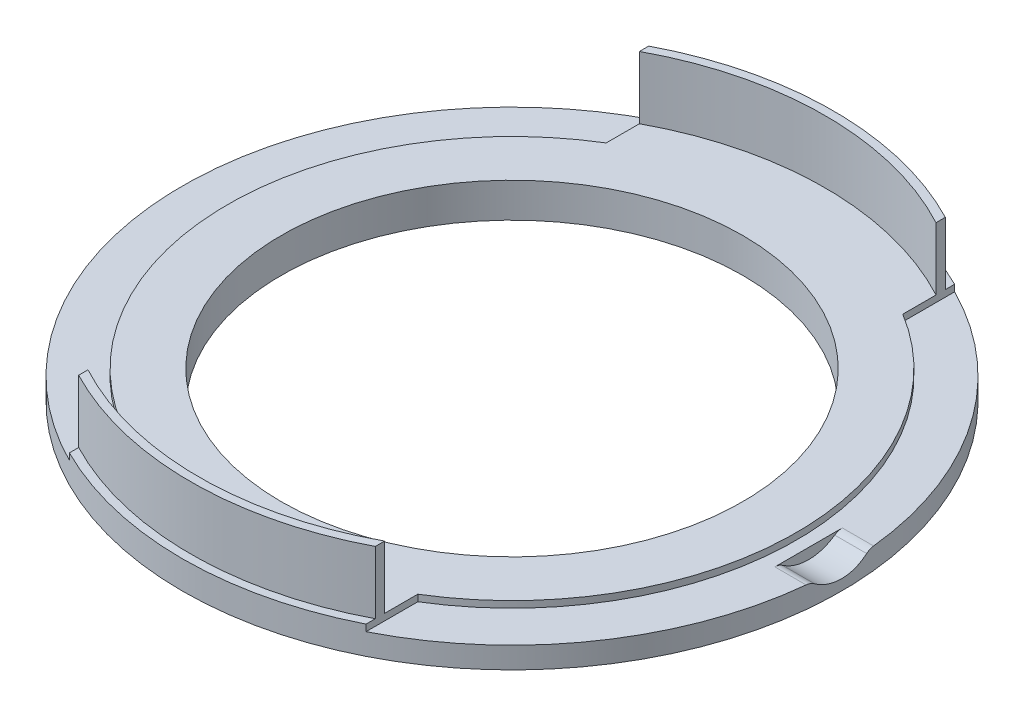
ISO-10303-21;
HEADER;
FILE_DESCRIPTION(('STEP AP214'),'2;1');
FILE_NAME('part.step','',(''),(''),'','','');
FILE_SCHEMA(('AUTOMOTIVE_DESIGN { 1 0 10303 214 1 1 1 1 }'));
ENDSEC;
DATA;
#1=APPLICATION_CONTEXT('core data for automotive mechanical design processes');
#2=APPLICATION_PROTOCOL_DEFINITION('international standard','automotive_design',2000,#1);
#3=PRODUCT_CONTEXT('',#1,'mechanical');
#4=PRODUCT('Part','Part','',(#3));
#5=PRODUCT_RELATED_PRODUCT_CATEGORY('part','',(#4));
#6=PRODUCT_DEFINITION_FORMATION('','',#4);
#7=PRODUCT_DEFINITION_CONTEXT('part definition',#1,'design');
#8=PRODUCT_DEFINITION('design','',#6,#7);
#9=PRODUCT_DEFINITION_SHAPE('','',#8);
#10=(LENGTH_UNIT() NAMED_UNIT(*) SI_UNIT(.MILLI.,.METRE.));
#11=(NAMED_UNIT(*) PLANE_ANGLE_UNIT() SI_UNIT($,.RADIAN.));
#12=(NAMED_UNIT(*) SI_UNIT($,.STERADIAN.) SOLID_ANGLE_UNIT());
#13=UNCERTAINTY_MEASURE_WITH_UNIT(LENGTH_MEASURE(1.E-05),#10,'distance_accuracy_value','');
#14=(GEOMETRIC_REPRESENTATION_CONTEXT(3) GLOBAL_UNCERTAINTY_ASSIGNED_CONTEXT((#13)) GLOBAL_UNIT_ASSIGNED_CONTEXT((#10,
#11,#12)) REPRESENTATION_CONTEXT('',''));
#15=CARTESIAN_POINT('',(0.,0.,0.));
#16=DIRECTION('',(0.,0.,1.));
#17=DIRECTION('',(1.,0.,0.));
#18=AXIS2_PLACEMENT_3D('',#15,#16,#17);
#19=CARTESIAN_POINT('',(0.,1.7,0.));
#20=DIRECTION('',(0.,-1.,0.));
#21=DIRECTION('',(0.,0.,-1.));
#22=AXIS2_PLACEMENT_3D('',#19,#20,#21);
#23=PLANE('',#22);
#24=CARTESIAN_POINT('',(0.,1.7,0.));
#25=DIRECTION('',(0.,1.,0.));
#26=DIRECTION('',(0.,0.,1.));
#27=AXIS2_PLACEMENT_3D('',#24,#25,#26);
#28=CIRCLE('',#27,19.5);
#29=CARTESIAN_POINT('',(-9.,1.7,17.2988438920062));
#30=VERTEX_POINT('',#29);
#31=CARTESIAN_POINT('',(9.,1.7,17.2988438920062));
#32=VERTEX_POINT('',#31);
#33=EDGE_CURVE('E49',#30,#32,#28,.T.);
#34=ORIENTED_EDGE('',*,*,#33,.F.);
#35=DIRECTION('',(0.,0.,1.));
#36=VECTOR('',#35,1.);
#37=CARTESIAN_POINT('',(-9.,1.7,11.4979123538233));
#38=LINE('',#37,#36);
#39=CARTESIAN_POINT('',(-9.00000000000001,1.7,17.8605710994917));
#40=VERTEX_POINT('',#39);
#41=EDGE_CURVE('E258',#30,#40,#38,.T.);
#42=ORIENTED_EDGE('',*,*,#41,.T.);
#43=CARTESIAN_POINT('',(0.,1.7,0.));
#44=DIRECTION('',(0.,1.,0.));
#45=DIRECTION('',(0.,0.,1.));
#46=AXIS2_PLACEMENT_3D('',#43,#44,#45);
#47=CIRCLE('',#46,20.);
#48=CARTESIAN_POINT('',(9.,1.7,17.8605710994918));
#49=VERTEX_POINT('',#48);
#50=EDGE_CURVE('E257',#40,#49,#47,.T.);
#51=ORIENTED_EDGE('',*,*,#50,.T.);
#52=DIRECTION('',(0.,0.,-1.));
#53=VECTOR('',#52,1.);
#54=CARTESIAN_POINT('',(9.,1.7,11.4979123538233));
#55=LINE('',#54,#53);
#56=EDGE_CURVE('E261',#49,#32,#55,.T.);
#57=ORIENTED_EDGE('',*,*,#56,.T.);
#58=EDGE_LOOP('',(#34,#42,#51,#57));
#59=FACE_BOUND('',#58,.T.);
#60=ADVANCED_FACE('F33',(#59),#23,.F.);
#61=CARTESIAN_POINT('',(0.,1.7,0.));
#62=DIRECTION('',(0.,-1.,0.));
#63=DIRECTION('',(0.,0.,-1.));
#64=AXIS2_PLACEMENT_3D('',#61,#62,#63);
#65=CIRCLE('',#64,14.);
#66=CARTESIAN_POINT('',(0.,1.7,-14.));
#67=VERTEX_POINT('',#66);
#68=EDGE_CURVE('E285',#67,#67,#65,.T.);
#69=ORIENTED_EDGE('',*,*,#68,.T.);
#70=EDGE_LOOP('',(#69));
#71=FACE_BOUND('',#70,.T.);
#72=CARTESIAN_POINT('',(0.,1.7,0.));
#73=DIRECTION('',(0.,-1.,0.));
#74=DIRECTION('',(0.,0.,1.));
#75=AXIS2_PLACEMENT_3D('',#72,#73,#74);
#76=CIRCLE('',#75,19.);
#77=CARTESIAN_POINT('',(9.,1.7,16.7332005306815));
#78=VERTEX_POINT('',#77);
#79=CARTESIAN_POINT('',(-9.,1.7,16.7332005306815));
#80=VERTEX_POINT('',#79);
#81=EDGE_CURVE('E193',#78,#80,#76,.T.);
#82=ORIENTED_EDGE('',*,*,#81,.F.);
#83=CARTESIAN_POINT('',(9.,1.7,14.7160626527614));
#84=VERTEX_POINT('',#83);
#85=EDGE_CURVE('E260',#78,#84,#55,.T.);
#86=ORIENTED_EDGE('',*,*,#85,.T.);
#87=CARTESIAN_POINT('',(0.,1.7,0.));
#88=DIRECTION('',(0.,-1.,0.));
#89=DIRECTION('',(0.,0.,-1.));
#90=AXIS2_PLACEMENT_3D('',#87,#88,#89);
#91=CIRCLE('',#90,17.25);
#92=CARTESIAN_POINT('',(9.,1.7,-14.7160626527614));
#93=VERTEX_POINT('',#92);
#94=EDGE_CURVE('E288',#93,#84,#91,.T.);
#95=ORIENTED_EDGE('',*,*,#94,.F.);
#96=DIRECTION('',(0.,0.,-1.));
#97=VECTOR('',#96,1.);
#98=CARTESIAN_POINT('',(9.,1.7,-17.8605710994917));
#99=LINE('',#98,#97);
#100=CARTESIAN_POINT('',(9.,1.7,-16.7332005306815));
#101=VERTEX_POINT('',#100);
#102=EDGE_CURVE('E232',#93,#101,#99,.T.);
#103=ORIENTED_EDGE('',*,*,#102,.T.);
#104=CARTESIAN_POINT('',(0.,1.7,0.));
#105=DIRECTION('',(0.,-1.,0.));
#106=DIRECTION('',(0.,0.,1.));
#107=AXIS2_PLACEMENT_3D('',#104,#105,#106);
#108=CIRCLE('',#107,19.);
#109=CARTESIAN_POINT('',(-9.,1.7,-16.7332005306815));
#110=VERTEX_POINT('',#109);
#111=EDGE_CURVE('E196',#110,#101,#108,.T.);
#112=ORIENTED_EDGE('',*,*,#111,.F.);
#113=DIRECTION('',(0.,0.,1.));
#114=VECTOR('',#113,1.);
#115=CARTESIAN_POINT('',(-9.,1.7,-17.8605710994918));
#116=LINE('',#115,#114);
#117=CARTESIAN_POINT('',(-9.,1.7,-14.7160626527614));
#118=VERTEX_POINT('',#117);
#119=EDGE_CURVE('E237',#110,#118,#116,.T.);
#120=ORIENTED_EDGE('',*,*,#119,.T.);
#121=CARTESIAN_POINT('',(-9.,1.7,14.7160626527614));
#122=VERTEX_POINT('',#121);
#123=EDGE_CURVE('E289',#122,#118,#91,.T.);
#124=ORIENTED_EDGE('',*,*,#123,.F.);
#125=EDGE_CURVE('E57',#122,#80,#38,.T.);
#126=ORIENTED_EDGE('',*,*,#125,.T.);
#127=EDGE_LOOP('',(#82,#86,#95,#103,#112,#120,#124,#126));
#128=FACE_BOUND('',#127,.T.);
#129=ADVANCED_FACE('F352',(#71,#128),#23,.F.);
#130=CARTESIAN_POINT('',(0.,1.3,0.));
#131=DIRECTION('',(0.,1.,0.));
#132=DIRECTION('',(0.,0.,1.));
#133=AXIS2_PLACEMENT_3D('',#130,#131,#132);
#134=PLANE('',#133);
#135=CARTESIAN_POINT('',(0.,1.3,0.));
#136=DIRECTION('',(0.,1.,0.));
#137=DIRECTION('',(0.,0.,1.));
#138=AXIS2_PLACEMENT_3D('',#135,#136,#137);
#139=CIRCLE('',#138,20.);
#140=CARTESIAN_POINT('',(9.,1.3,17.8605710994918));
#141=VERTEX_POINT('',#140);
#142=CARTESIAN_POINT('',(19.8949114097047,1.3,2.04755952294433));
#143=VERTEX_POINT('',#142);
#144=EDGE_CURVE('E298',#141,#143,#139,.T.);
#145=ORIENTED_EDGE('',*,*,#144,.T.);
#146=DIRECTION('',(-1.,0.,0.));
#147=VECTOR('',#146,1.);
#148=CARTESIAN_POINT('',(18.,1.3,2.04755952294433));
#149=LINE('',#148,#147);
#150=CARTESIAN_POINT('',(18.,1.3,2.04755952294433));
#151=VERTEX_POINT('',#150);
#152=EDGE_CURVE('E436',#143,#151,#149,.T.);
#153=ORIENTED_EDGE('',*,*,#152,.T.);
#154=DIRECTION('',(0.,0.,-1.));
#155=VECTOR('',#154,1.);
#156=CARTESIAN_POINT('',(18.,1.3,0.));
#157=LINE('',#156,#155);
#158=CARTESIAN_POINT('',(18.,1.3,-2.04755952294433));
#159=VERTEX_POINT('',#158);
#160=EDGE_CURVE('E315',#151,#159,#157,.T.);
#161=ORIENTED_EDGE('',*,*,#160,.T.);
#162=DIRECTION('',(-1.,0.,0.));
#163=VECTOR('',#162,1.);
#164=CARTESIAN_POINT('',(19.9210315997942,1.3,-2.04755952294433));
#165=LINE('',#164,#163);
#166=CARTESIAN_POINT('',(19.8949114097047,1.3,-2.04755952294433));
#167=VERTEX_POINT('',#166);
#168=EDGE_CURVE('E434',#159,#167,#165,.F.);
#169=ORIENTED_EDGE('',*,*,#168,.T.);
#170=CARTESIAN_POINT('',(9.,1.3,-17.8605710994918));
#171=VERTEX_POINT('',#170);
#172=EDGE_CURVE('E301',#167,#171,#139,.T.);
#173=ORIENTED_EDGE('',*,*,#172,.T.);
#174=DIRECTION('',(0.,0.,-1.));
#175=VECTOR('',#174,1.);
#176=CARTESIAN_POINT('',(9.,1.3,-17.8605710994917));
#177=LINE('',#176,#175);
#178=CARTESIAN_POINT('',(9.,1.3,-14.7160626527614));
#179=VERTEX_POINT('',#178);
#180=EDGE_CURVE('E231',#179,#171,#177,.T.);
#181=ORIENTED_EDGE('',*,*,#180,.F.);
#182=CARTESIAN_POINT('',(0.,1.3,0.));
#183=DIRECTION('',(0.,1.,0.));
#184=DIRECTION('',(0.,0.,1.));
#185=AXIS2_PLACEMENT_3D('',#182,#183,#184);
#186=CIRCLE('',#185,17.25);
#187=CARTESIAN_POINT('',(9.,1.3,14.7160626527614));
#188=VERTEX_POINT('',#187);
#189=EDGE_CURVE('E293',#188,#179,#186,.T.);
#190=ORIENTED_EDGE('',*,*,#189,.F.);
#191=DIRECTION('',(0.,0.,-1.));
#192=VECTOR('',#191,1.);
#193=CARTESIAN_POINT('',(9.,1.3,11.4979123538233));
#194=LINE('',#193,#192);
#195=EDGE_CURVE('E266',#141,#188,#194,.T.);
#196=ORIENTED_EDGE('',*,*,#195,.F.);
#197=EDGE_LOOP('',(#145,#153,#161,#169,#173,#181,#190,#196));
#198=FACE_BOUND('',#197,.T.);
#199=ADVANCED_FACE('F362',(#198),#134,.T.);
#200=CARTESIAN_POINT('',(-9.,1.3,-14.7160626527614));
#201=VERTEX_POINT('',#200);
#202=CARTESIAN_POINT('',(-9.,1.3,14.7160626527614));
#203=VERTEX_POINT('',#202);
#204=EDGE_CURVE('E297',#201,#203,#186,.T.);
#205=ORIENTED_EDGE('',*,*,#204,.F.);
#206=DIRECTION('',(0.,0.,1.));
#207=VECTOR('',#206,1.);
#208=CARTESIAN_POINT('',(-9.,1.3,-17.8605710994918));
#209=LINE('',#208,#207);
#210=CARTESIAN_POINT('',(-9.,1.3,-17.8605710994918));
#211=VERTEX_POINT('',#210);
#212=EDGE_CURVE('E243',#211,#201,#209,.T.);
#213=ORIENTED_EDGE('',*,*,#212,.F.);
#214=CARTESIAN_POINT('',(-9.,1.3,17.8605710994918));
#215=VERTEX_POINT('',#214);
#216=EDGE_CURVE('E302',#211,#215,#139,.T.);
#217=ORIENTED_EDGE('',*,*,#216,.T.);
#218=DIRECTION('',(0.,0.,1.));
#219=VECTOR('',#218,1.);
#220=CARTESIAN_POINT('',(-9.,1.3,11.4979123538233));
#221=LINE('',#220,#219);
#222=EDGE_CURVE('E255',#203,#215,#221,.T.);
#223=ORIENTED_EDGE('',*,*,#222,.F.);
#224=EDGE_LOOP('',(#205,#213,#217,#223));
#225=FACE_BOUND('',#224,.T.);
#226=ADVANCED_FACE('F357',(#225),#134,.T.);
#227=CARTESIAN_POINT('',(0.,1.7,0.));
#228=DIRECTION('',(0.,-1.,0.));
#229=DIRECTION('',(0.,0.,-1.));
#230=AXIS2_PLACEMENT_3D('',#227,#228,#229);
#231=CYLINDRICAL_SURFACE('',#230,17.25);
#232=ORIENTED_EDGE('',*,*,#189,.T.);
#233=DIRECTION('',(0.,-1.,0.));
#234=VECTOR('',#233,1.);
#235=CARTESIAN_POINT('',(9.,1.7,-14.7160626527614));
#236=LINE('',#235,#234);
#237=EDGE_CURVE('E253',#179,#93,#236,.F.);
#238=ORIENTED_EDGE('',*,*,#237,.T.);
#239=ORIENTED_EDGE('',*,*,#94,.T.);
#240=DIRECTION('',(0.,-1.,0.));
#241=VECTOR('',#240,1.);
#242=CARTESIAN_POINT('',(9.,1.7,14.7160626527614));
#243=LINE('',#242,#241);
#244=EDGE_CURVE('E274',#84,#188,#243,.T.);
#245=ORIENTED_EDGE('',*,*,#244,.T.);
#246=EDGE_LOOP('',(#232,#238,#239,#245));
#247=FACE_BOUND('',#246,.T.);
#248=ADVANCED_FACE('F353',(#247),#231,.T.);
#249=ORIENTED_EDGE('',*,*,#123,.T.);
#250=DIRECTION('',(0.,-1.,0.));
#251=VECTOR('',#250,1.);
#252=CARTESIAN_POINT('',(-9.,1.7,-14.7160626527614));
#253=LINE('',#252,#251);
#254=EDGE_CURVE('E251',#118,#201,#253,.T.);
#255=ORIENTED_EDGE('',*,*,#254,.T.);
#256=ORIENTED_EDGE('',*,*,#204,.T.);
#257=DIRECTION('',(0.,-1.,0.));
#258=VECTOR('',#257,1.);
#259=CARTESIAN_POINT('',(-9.,1.7,14.7160626527614));
#260=LINE('',#259,#258);
#261=EDGE_CURVE('E276',#203,#122,#260,.F.);
#262=ORIENTED_EDGE('',*,*,#261,.T.);
#263=EDGE_LOOP('',(#249,#255,#256,#262));
#264=FACE_BOUND('',#263,.T.);
#265=ADVANCED_FACE('F356',(#264),#231,.T.);
#266=CARTESIAN_POINT('',(0.,0.,0.));
#267=DIRECTION('',(0.,1.,0.));
#268=DIRECTION('',(0.,0.,1.));
#269=AXIS2_PLACEMENT_3D('',#266,#267,#268);
#270=PLANE('',#269);
#271=CARTESIAN_POINT('',(0.,0.,0.));
#272=DIRECTION('',(0.,1.,0.));
#273=DIRECTION('',(0.,0.,1.));
#274=AXIS2_PLACEMENT_3D('',#271,#272,#273);
#275=CIRCLE('',#274,17.25);
#276=CARTESIAN_POINT('',(0.,0.,17.25));
#277=VERTEX_POINT('',#276);
#278=EDGE_CURVE('E292',#277,#277,#275,.T.);
#279=ORIENTED_EDGE('',*,*,#278,.T.);
#280=EDGE_LOOP('',(#279));
#281=FACE_BOUND('',#280,.T.);
#282=CARTESIAN_POINT('',(0.,0.,0.));
#283=DIRECTION('',(0.,1.,0.));
#284=DIRECTION('',(0.,0.,1.));
#285=AXIS2_PLACEMENT_3D('',#282,#283,#284);
#286=CIRCLE('',#285,20.);
#287=CARTESIAN_POINT('',(0.,0.,20.));
#288=VERTEX_POINT('',#287);
#289=EDGE_CURVE('E303',#288,#288,#286,.T.);
#290=ORIENTED_EDGE('',*,*,#289,.F.);
#291=EDGE_LOOP('',(#290));
#292=FACE_BOUND('',#291,.T.);
#293=ADVANCED_FACE('F365',(#281,#292),#270,.F.);
#294=CARTESIAN_POINT('',(0.,1.3,0.));
#295=DIRECTION('',(0.,-1.,0.));
#296=DIRECTION('',(0.,0.,-1.));
#297=AXIS2_PLACEMENT_3D('',#294,#295,#296);
#298=CYLINDRICAL_SURFACE('',#297,20.);
#299=CARTESIAN_POINT('',(19.8828443639234,1.7,-2.16159663212173));
#300=CARTESIAN_POINT('',(19.8880446440185,1.63917047527766,-2.11376553205792));
#301=CARTESIAN_POINT('',(19.8933493920477,1.58037689984762,-2.06336307216184));
#302=CARTESIAN_POINT('',(19.9040163811645,1.4672475217548,-1.95779068258002));
#303=CARTESIAN_POINT('',(19.9093786203119,1.41291156918126,-1.9026209133481));
#304=CARTESIAN_POINT('',(19.9200075831393,1.30909807509753,-1.78790678059561));
#305=CARTESIAN_POINT('',(19.9252743408965,1.25961877126869,-1.7283640177049));
#306=CARTESIAN_POINT('',(19.9355647787124,1.16585321775837,-1.60532833177326));
#307=CARTESIAN_POINT('',(19.9405884622588,1.12156689355309,-1.5418354654398));
#308=CARTESIAN_POINT('',(19.9550837409396,0.996938742136103,-1.34599154505257));
#309=CARTESIAN_POINT('',(19.9639831701898,0.924793913675809,-1.20823773992745));
#310=CARTESIAN_POINT('',(19.9792233773762,0.804727882324251,-0.922548679348743));
#311=CARTESIAN_POINT('',(19.985564968834,0.756798976318357,-0.774616678625962));
#312=CARTESIAN_POINT('',(19.9949606352238,0.686669728196501,-0.473411044143487));
#313=CARTESIAN_POINT('',(19.9980305639061,0.664345272096202,-0.320166919900228));
#314=CARTESIAN_POINT('',(20.0005897038949,0.645698140778927,-0.0120629285885591));
#315=CARTESIAN_POINT('',(20.00007860347,0.649377729234872,0.142797077972003));
#316=CARTESIAN_POINT('',(19.9955495554137,0.682508158712204,0.448581973065739));
#317=CARTESIAN_POINT('',(19.9915560961616,0.711779042314935,0.599526776654813));
#318=CARTESIAN_POINT('',(19.9805374017945,0.794993341003631,0.894374624779737));
#319=CARTESIAN_POINT('',(19.9735115086845,0.848942110991618,1.03827613347132));
#320=CARTESIAN_POINT('',(19.9571756474967,0.980164937446789,1.31549184697757));
#321=CARTESIAN_POINT('',(19.9478574222216,1.05752355550421,1.4487654184119));
#322=CARTESIAN_POINT('',(19.9279848434725,1.23328622502498,1.70039378500977));
#323=CARTESIAN_POINT('',(19.9174320267269,1.33166423657981,1.81876675405323));
#324=CARTESIAN_POINT('',(19.9028140435365,1.48005876275286,1.96971109213048));
#325=CARTESIAN_POINT('',(19.8987717636055,1.52236875403764,2.0100810144801));
#326=CARTESIAN_POINT('',(19.8907485812712,1.60939880265213,2.08797593758395));
#327=CARTESIAN_POINT('',(19.8867675814081,1.65411438054976,2.12550593285355));
#328=CARTESIAN_POINT('',(19.8828443639234,1.7,2.16159663212173));
#329=B_SPLINE_CURVE_WITH_KNOTS('',3,(#299,#300,#301,#302,#303,#304,#305,#306,#307,#308,#309,
#310,#311,#312,#313,#314,#315,#316,#317,#318,#319,#320,#321,#322,#323,#324,#325,#326,#327,#328),
.UNSPECIFIED.,.F.,.F.,(4,2,2,2,2,2,2,2,2,2,2,2,2,2,4),(0.,0.232595289162788,0.465182752889074,
0.697685503793939,0.930184917671582,1.39503392817193,1.8597349763871,2.32217380237872,
2.78465288453661,3.243905746733,3.70325831039864,4.16429037601698,4.6247545691489,
4.80051987232416,4.97596850788596),.UNSPECIFIED.);
#330=CARTESIAN_POINT('',(19.9370049738648,1.15352112676054,-1.58613765861886));
#331=VERTEX_POINT('',#330);
#332=CARTESIAN_POINT('',(19.9370049738648,1.15352112676056,1.58613765861884));
#333=VERTEX_POINT('',#332);
#334=EDGE_CURVE('E296',#331,#333,#329,.T.);
#335=ORIENTED_EDGE('',*,*,#334,.T.);
#336=CARTESIAN_POINT('',(19.9370049738649,1.15352112676056,1.58613765861884));
#337=CARTESIAN_POINT('',(19.9340423536432,1.17990469495711,1.62343191719853));
#338=CARTESIAN_POINT('',(19.9307840021488,1.20301083969387,1.6630117132571));
#339=CARTESIAN_POINT('',(19.9238178010792,1.24167394193405,1.74443873564836));
#340=CARTESIAN_POINT('',(19.9201233126108,1.25740609687059,1.78620393397691));
#341=CARTESIAN_POINT('',(19.9129693640299,1.27954160740439,1.86410892435449));
#342=CARTESIAN_POINT('',(19.9095846819547,1.28710549764143,1.89993053982506));
#343=CARTESIAN_POINT('',(19.9024778111487,1.29739386429433,1.97301169420315));
#344=CARTESIAN_POINT('',(19.8987499912168,1.30001241817822,2.01028561855133));
#345=CARTESIAN_POINT('',(19.8949114097047,1.3,2.04755952294433));
#346=B_SPLINE_CURVE_WITH_KNOTS('',3,(#336,#337,#338,#339,#340,#341,#342,#343,#344,#345),
.UNSPECIFIED.,.F.,.F.,(4,2,2,2,4),(0.,0.137165363850037,0.270882081167954,0.380852148833274,
0.49315203562515),.UNSPECIFIED.);
#347=EDGE_CURVE('E437',#333,#143,#346,.T.);
#348=ORIENTED_EDGE('',*,*,#347,.T.);
#349=ORIENTED_EDGE('',*,*,#144,.F.);
#350=DIRECTION('',(0.,-1.,0.));
#351=VECTOR('',#350,1.);
#352=CARTESIAN_POINT('',(9.,1.7,17.8605710994918));
#353=LINE('',#352,#351);
#354=EDGE_CURVE('E263',#49,#141,#353,.T.);
#355=ORIENTED_EDGE('',*,*,#354,.F.);
#356=ORIENTED_EDGE('',*,*,#50,.F.);
#357=DIRECTION('',(0.,-1.,0.));
#358=VECTOR('',#357,1.);
#359=CARTESIAN_POINT('',(-9.00000000000001,1.7,17.8605710994917));
#360=LINE('',#359,#358);
#361=EDGE_CURVE('E271',#40,#215,#360,.T.);
#362=ORIENTED_EDGE('',*,*,#361,.T.);
#363=ORIENTED_EDGE('',*,*,#216,.F.);
#364=DIRECTION('',(0.,-1.,0.));
#365=VECTOR('',#364,1.);
#366=CARTESIAN_POINT('',(-9.,1.7,-17.8605710994918));
#367=LINE('',#366,#365);
#368=CARTESIAN_POINT('',(-9.,1.7,-17.8605710994918));
#369=VERTEX_POINT('',#368);
#370=EDGE_CURVE('E240',#369,#211,#367,.T.);
#371=ORIENTED_EDGE('',*,*,#370,.F.);
#372=CARTESIAN_POINT('',(0.,1.7,0.));
#373=DIRECTION('',(0.,1.,0.));
#374=DIRECTION('',(0.,0.,1.));
#375=AXIS2_PLACEMENT_3D('',#372,#373,#374);
#376=CIRCLE('',#375,20.);
#377=CARTESIAN_POINT('',(9.,1.7,-17.8605710994918));
#378=VERTEX_POINT('',#377);
#379=EDGE_CURVE('E234',#378,#369,#376,.T.);
#380=ORIENTED_EDGE('',*,*,#379,.F.);
#381=DIRECTION('',(0.,-1.,0.));
#382=VECTOR('',#381,1.);
#383=CARTESIAN_POINT('',(9.,1.7,-17.8605710994918));
#384=LINE('',#383,#382);
#385=EDGE_CURVE('E248',#378,#171,#384,.T.);
#386=ORIENTED_EDGE('',*,*,#385,.T.);
#387=ORIENTED_EDGE('',*,*,#172,.F.);
#388=CARTESIAN_POINT('',(19.8949114097047,1.3,-2.04755952294433));
#389=CARTESIAN_POINT('',(19.8996099904254,1.30004192970977,-2.00196606867309));
#390=CARTESIAN_POINT('',(19.9041400218185,1.29610396386711,-1.9563521842008));
#391=CARTESIAN_POINT('',(19.9126629912746,1.28074155893445,-1.86754664949761));
#392=CARTESIAN_POINT('',(19.9166665835224,1.2695081847802,-1.82432292713542));
#393=CARTESIAN_POINT('',(19.923506061721,1.2426526901471,-1.7478886389027));
#394=CARTESIAN_POINT('',(19.9264224427602,1.22818375408811,-1.71427565955831));
#395=CARTESIAN_POINT('',(19.9319633977579,1.1944378678169,-1.64862176916873));
#396=CARTESIAN_POINT('',(19.9345804893787,1.17506563919879,-1.61662918687742));
#397=CARTESIAN_POINT('',(19.9370049738648,1.15352112676056,-1.58613765861884));
#398=B_SPLINE_CURVE_WITH_KNOTS('',3,(#388,#389,#390,#391,#392,#393,#394,#395,#396,#397),
.UNSPECIFIED.,.F.,.F.,(4,2,2,2,4),(0.,0.137345495462249,0.271231581503104,0.381030100851631,
0.493152460084702),.UNSPECIFIED.);
#399=EDGE_CURVE('E440',#167,#331,#398,.T.);
#400=ORIENTED_EDGE('',*,*,#399,.T.);
#401=EDGE_LOOP('',(#335,#348,#349,#355,#356,#362,#363,#371,#380,#386,#387,#400));
#402=FACE_BOUND('',#401,.T.);
#403=ORIENTED_EDGE('',*,*,#289,.T.);
#404=EDGE_LOOP('',(#403));
#405=FACE_BOUND('',#404,.T.);
#406=ADVANCED_FACE('F317',(#402,#405),#298,.T.);
#407=CARTESIAN_POINT('',(0.,-0.4,0.));
#408=DIRECTION('',(0.,-1.,0.));
#409=DIRECTION('',(0.,0.,-1.));
#410=AXIS2_PLACEMENT_3D('',#407,#408,#409);
#411=CIRCLE('',#410,17.25);
#412=CARTESIAN_POINT('',(0.,-0.4,-17.25));
#413=VERTEX_POINT('',#412);
#414=EDGE_CURVE('E282',#413,#413,#411,.T.);
#415=ORIENTED_EDGE('',*,*,#414,.F.);
#416=EDGE_LOOP('',(#415));
#417=FACE_BOUND('',#416,.T.);
#418=ORIENTED_EDGE('',*,*,#278,.F.);
#419=EDGE_LOOP('',(#418));
#420=FACE_BOUND('',#419,.T.);
#421=ADVANCED_FACE('F347',(#417,#420),#231,.T.);
#422=CARTESIAN_POINT('',(0.,-0.4,0.));
#423=DIRECTION('',(0.,-1.,0.));
#424=DIRECTION('',(0.,0.,-1.));
#425=AXIS2_PLACEMENT_3D('',#422,#423,#424);
#426=PLANE('',#425);
#427=ORIENTED_EDGE('',*,*,#414,.T.);
#428=EDGE_LOOP('',(#427));
#429=FACE_BOUND('',#428,.T.);
#430=CARTESIAN_POINT('',(0.,-0.4,0.));
#431=DIRECTION('',(0.,-1.,0.));
#432=DIRECTION('',(0.,0.,-1.));
#433=AXIS2_PLACEMENT_3D('',#430,#431,#432);
#434=CIRCLE('',#433,14.);
#435=CARTESIAN_POINT('',(0.,-0.4,-14.));
#436=VERTEX_POINT('',#435);
#437=EDGE_CURVE('E279',#436,#436,#434,.T.);
#438=ORIENTED_EDGE('',*,*,#437,.F.);
#439=EDGE_LOOP('',(#438));
#440=FACE_BOUND('',#439,.T.);
#441=ADVANCED_FACE('F343',(#429,#440),#426,.T.);
#442=CARTESIAN_POINT('',(0.,1.3,0.));
#443=DIRECTION('',(0.,-1.,0.));
#444=DIRECTION('',(0.,0.,-1.));
#445=AXIS2_PLACEMENT_3D('',#442,#443,#444);
#446=CYLINDRICAL_SURFACE('',#445,14.);
#447=ORIENTED_EDGE('',*,*,#68,.F.);
#448=EDGE_LOOP('',(#447));
#449=FACE_BOUND('',#448,.T.);
#450=ORIENTED_EDGE('',*,*,#437,.T.);
#451=EDGE_LOOP('',(#450));
#452=FACE_BOUND('',#451,.T.);
#453=ADVANCED_FACE('F346',(#449,#452),#446,.F.);
#454=CARTESIAN_POINT('',(0.,1.7,0.));
#455=DIRECTION('',(0.,1.,0.));
#456=DIRECTION('',(0.,0.,1.));
#457=AXIS2_PLACEMENT_3D('',#454,#455,#456);
#458=CIRCLE('',#457,19.5);
#459=CARTESIAN_POINT('',(9.,1.7,-17.2988438920062));
#460=VERTEX_POINT('',#459);
#461=CARTESIAN_POINT('',(-9.,1.7,-17.2988438920062));
#462=VERTEX_POINT('',#461);
#463=EDGE_CURVE('E199',#460,#462,#458,.T.);
#464=ORIENTED_EDGE('',*,*,#463,.F.);
#465=EDGE_CURVE('E235',#460,#378,#99,.T.);
#466=ORIENTED_EDGE('',*,*,#465,.T.);
#467=ORIENTED_EDGE('',*,*,#379,.T.);
#468=EDGE_CURVE('E238',#369,#462,#116,.T.);
#469=ORIENTED_EDGE('',*,*,#468,.T.);
#470=EDGE_LOOP('',(#464,#466,#467,#469));
#471=FACE_BOUND('',#470,.T.);
#472=ADVANCED_FACE('F341',(#471),#23,.F.);
#473=CARTESIAN_POINT('',(-9.,1.7,11.4979123538233));
#474=DIRECTION('',(1.,0.,0.));
#475=DIRECTION('',(0.,0.,-1.));
#476=AXIS2_PLACEMENT_3D('',#473,#474,#475);
#477=PLANE('',#476);
#478=ORIENTED_EDGE('',*,*,#261,.F.);
#479=ORIENTED_EDGE('',*,*,#222,.T.);
#480=ORIENTED_EDGE('',*,*,#361,.F.);
#481=ORIENTED_EDGE('',*,*,#41,.F.);
#482=DIRECTION('',(0.,-1.,0.));
#483=VECTOR('',#482,1.);
#484=CARTESIAN_POINT('',(-9.00000000000001,5.5,17.2988438920062));
#485=LINE('',#484,#483);
#486=CARTESIAN_POINT('',(-9.00000000000001,5.5,17.2988438920062));
#487=VERTEX_POINT('',#486);
#488=EDGE_CURVE('E392',#487,#30,#485,.T.);
#489=ORIENTED_EDGE('',*,*,#488,.F.);
#490=DIRECTION('',(0.,0.,1.));
#491=VECTOR('',#490,1.);
#492=CARTESIAN_POINT('',(-9.00000000000001,5.5,17.2988438920062));
#493=LINE('',#492,#491);
#494=CARTESIAN_POINT('',(-9.00000000000001,5.5,16.7332005306815));
#495=VERTEX_POINT('',#494);
#496=EDGE_CURVE('E189',#495,#487,#493,.T.);
#497=ORIENTED_EDGE('',*,*,#496,.F.);
#498=DIRECTION('',(0.,-1.,0.));
#499=VECTOR('',#498,1.);
#500=CARTESIAN_POINT('',(-9.00000000000001,5.5,16.7332005306815));
#501=LINE('',#500,#499);
#502=EDGE_CURVE('E201',#495,#80,#501,.T.);
#503=ORIENTED_EDGE('',*,*,#502,.T.);
#504=ORIENTED_EDGE('',*,*,#125,.F.);
#505=EDGE_LOOP('',(#478,#479,#480,#481,#489,#497,#503,#504));
#506=FACE_BOUND('',#505,.T.);
#507=ADVANCED_FACE('F338',(#506),#477,.F.);
#508=CARTESIAN_POINT('',(9.,1.7,11.4979123538233));
#509=DIRECTION('',(-1.,0.,0.));
#510=DIRECTION('',(0.,0.,1.));
#511=AXIS2_PLACEMENT_3D('',#508,#509,#510);
#512=PLANE('',#511);
#513=ORIENTED_EDGE('',*,*,#244,.F.);
#514=ORIENTED_EDGE('',*,*,#85,.F.);
#515=DIRECTION('',(0.,-1.,0.));
#516=VECTOR('',#515,1.);
#517=CARTESIAN_POINT('',(9.,5.5,16.7332005306815));
#518=LINE('',#517,#516);
#519=CARTESIAN_POINT('',(9.,5.5,16.7332005306815));
#520=VERTEX_POINT('',#519);
#521=EDGE_CURVE('E180',#520,#78,#518,.T.);
#522=ORIENTED_EDGE('',*,*,#521,.F.);
#523=DIRECTION('',(0.,0.,-1.));
#524=VECTOR('',#523,1.);
#525=CARTESIAN_POINT('',(9.,5.5,17.2988438920062));
#526=LINE('',#525,#524);
#527=CARTESIAN_POINT('',(9.,5.5,17.2988438920062));
#528=VERTEX_POINT('',#527);
#529=EDGE_CURVE('E172',#528,#520,#526,.T.);
#530=ORIENTED_EDGE('',*,*,#529,.F.);
#531=DIRECTION('',(0.,-1.,0.));
#532=VECTOR('',#531,1.);
#533=CARTESIAN_POINT('',(9.,5.5,17.2988438920062));
#534=LINE('',#533,#532);
#535=EDGE_CURVE('E178',#528,#32,#534,.T.);
#536=ORIENTED_EDGE('',*,*,#535,.T.);
#537=ORIENTED_EDGE('',*,*,#56,.F.);
#538=ORIENTED_EDGE('',*,*,#354,.T.);
#539=ORIENTED_EDGE('',*,*,#195,.T.);
#540=EDGE_LOOP('',(#513,#514,#522,#530,#536,#537,#538,#539));
#541=FACE_BOUND('',#540,.T.);
#542=ADVANCED_FACE('F175',(#541),#512,.F.);
#543=CARTESIAN_POINT('',(9.,1.7,-17.8605710994917));
#544=DIRECTION('',(-1.,0.,0.));
#545=DIRECTION('',(0.,0.,1.));
#546=AXIS2_PLACEMENT_3D('',#543,#544,#545);
#547=PLANE('',#546);
#548=ORIENTED_EDGE('',*,*,#237,.F.);
#549=ORIENTED_EDGE('',*,*,#180,.T.);
#550=ORIENTED_EDGE('',*,*,#385,.F.);
#551=ORIENTED_EDGE('',*,*,#465,.F.);
#552=DIRECTION('',(0.,-1.,0.));
#553=VECTOR('',#552,1.);
#554=CARTESIAN_POINT('',(8.99999999999999,5.5,-17.2988438920062));
#555=LINE('',#554,#553);
#556=CARTESIAN_POINT('',(8.99999999999999,5.5,-17.2988438920062));
#557=VERTEX_POINT('',#556);
#558=EDGE_CURVE('E222',#557,#460,#555,.T.);
#559=ORIENTED_EDGE('',*,*,#558,.F.);
#560=DIRECTION('',(0.,0.,-1.));
#561=VECTOR('',#560,1.);
#562=CARTESIAN_POINT('',(9.,5.5,-16.7332005306815));
#563=LINE('',#562,#561);
#564=CARTESIAN_POINT('',(9.,5.5,-16.7332005306815));
#565=VERTEX_POINT('',#564);
#566=EDGE_CURVE('E208',#565,#557,#563,.T.);
#567=ORIENTED_EDGE('',*,*,#566,.F.);
#568=DIRECTION('',(0.,-1.,0.));
#569=VECTOR('',#568,1.);
#570=CARTESIAN_POINT('',(9.,5.5,-16.7332005306815));
#571=LINE('',#570,#569);
#572=EDGE_CURVE('E225',#565,#101,#571,.T.);
#573=ORIENTED_EDGE('',*,*,#572,.T.);
#574=ORIENTED_EDGE('',*,*,#102,.F.);
#575=EDGE_LOOP('',(#548,#549,#550,#551,#559,#567,#573,#574));
#576=FACE_BOUND('',#575,.T.);
#577=ADVANCED_FACE('F331',(#576),#547,.F.);
#578=CARTESIAN_POINT('',(-9.,1.7,-17.8605710994918));
#579=DIRECTION('',(1.,0.,0.));
#580=DIRECTION('',(0.,0.,-1.));
#581=AXIS2_PLACEMENT_3D('',#578,#579,#580);
#582=PLANE('',#581);
#583=ORIENTED_EDGE('',*,*,#254,.F.);
#584=ORIENTED_EDGE('',*,*,#119,.F.);
#585=DIRECTION('',(0.,-1.,0.));
#586=VECTOR('',#585,1.);
#587=CARTESIAN_POINT('',(-9.,5.5,-16.7332005306815));
#588=LINE('',#587,#586);
#589=CARTESIAN_POINT('',(-9.,5.5,-16.7332005306815));
#590=VERTEX_POINT('',#589);
#591=EDGE_CURVE('E213',#590,#110,#588,.T.);
#592=ORIENTED_EDGE('',*,*,#591,.F.);
#593=DIRECTION('',(0.,0.,1.));
#594=VECTOR('',#593,1.);
#595=CARTESIAN_POINT('',(-9.,5.5,-16.7332005306815));
#596=LINE('',#595,#594);
#597=CARTESIAN_POINT('',(-9.,5.5,-17.2988438920062));
#598=VERTEX_POINT('',#597);
#599=EDGE_CURVE('E212',#598,#590,#596,.T.);
#600=ORIENTED_EDGE('',*,*,#599,.F.);
#601=DIRECTION('',(0.,-1.,0.));
#602=VECTOR('',#601,1.);
#603=CARTESIAN_POINT('',(-9.,5.5,-17.2988438920062));
#604=LINE('',#603,#602);
#605=EDGE_CURVE('E219',#598,#462,#604,.T.);
#606=ORIENTED_EDGE('',*,*,#605,.T.);
#607=ORIENTED_EDGE('',*,*,#468,.F.);
#608=ORIENTED_EDGE('',*,*,#370,.T.);
#609=ORIENTED_EDGE('',*,*,#212,.T.);
#610=EDGE_LOOP('',(#583,#584,#592,#600,#606,#607,#608,#609));
#611=FACE_BOUND('',#610,.T.);
#612=ADVANCED_FACE('F326',(#611),#582,.F.);
#613=CARTESIAN_POINT('',(18.,3.4,0.));
#614=DIRECTION('',(1.,0.,0.));
#615=DIRECTION('',(0.,0.,-1.));
#616=AXIS2_PLACEMENT_3D('',#613,#614,#615);
#617=CYLINDRICAL_SURFACE('',#616,2.75);
#618=CARTESIAN_POINT('',(18.,3.4,0.));
#619=DIRECTION('',(1.,0.,0.));
#620=DIRECTION('',(0.,0.,-1.));
#621=AXIS2_PLACEMENT_3D('',#618,#619,#620);
#622=CIRCLE('',#621,2.75);
#623=CARTESIAN_POINT('',(18.,1.15352112676056,1.58613765861884));
#624=VERTEX_POINT('',#623);
#625=CARTESIAN_POINT('',(18.,1.15352112676056,-1.58613765861884));
#626=VERTEX_POINT('',#625);
#627=EDGE_CURVE('E228',#624,#626,#622,.T.);
#628=ORIENTED_EDGE('',*,*,#627,.F.);
#629=DIRECTION('',(1.,0.,0.));
#630=VECTOR('',#629,1.);
#631=CARTESIAN_POINT('',(18.,1.15352112676056,1.58613765861885));
#632=LINE('',#631,#630);
#633=EDGE_CURVE('E454',#624,#333,#632,.T.);
#634=ORIENTED_EDGE('',*,*,#633,.T.);
#635=ORIENTED_EDGE('',*,*,#334,.F.);
#636=DIRECTION('',(1.,0.,0.));
#637=VECTOR('',#636,1.);
#638=CARTESIAN_POINT('',(18.,1.15352112676056,-1.58613765861885));
#639=LINE('',#638,#637);
#640=EDGE_CURVE('E456',#331,#626,#639,.F.);
#641=ORIENTED_EDGE('',*,*,#640,.T.);
#642=EDGE_LOOP('',(#628,#634,#635,#641));
#643=FACE_BOUND('',#642,.T.);
#644=ADVANCED_FACE('F320',(#643),#617,.F.);
#645=CARTESIAN_POINT('',(18.,3.4,0.));
#646=DIRECTION('',(1.,0.,0.));
#647=DIRECTION('',(0.,0.,-1.));
#648=AXIS2_PLACEMENT_3D('',#645,#646,#647);
#649=PLANE('',#648);
#650=ORIENTED_EDGE('',*,*,#160,.F.);
#651=CARTESIAN_POINT('',(18.,0.5,2.04755952294433));
#652=DIRECTION('',(1.,0.,0.));
#653=DIRECTION('',(0.,0.,-1.));
#654=AXIS2_PLACEMENT_3D('',#651,#652,#653);
#655=CIRCLE('',#654,0.8);
#656=EDGE_CURVE('E42',#151,#624,#655,.F.);
#657=ORIENTED_EDGE('',*,*,#656,.T.);
#658=ORIENTED_EDGE('',*,*,#627,.T.);
#659=CARTESIAN_POINT('',(18.,0.5,-2.04755952294433));
#660=DIRECTION('',(1.,0.,0.));
#661=DIRECTION('',(0.,0.,-1.));
#662=AXIS2_PLACEMENT_3D('',#659,#660,#661);
#663=CIRCLE('',#662,0.8);
#664=EDGE_CURVE('E11',#626,#159,#663,.F.);
#665=ORIENTED_EDGE('',*,*,#664,.T.);
#666=EDGE_LOOP('',(#650,#657,#658,#665));
#667=FACE_BOUND('',#666,.T.);
#668=ADVANCED_FACE('F325',(#667),#649,.T.);
#669=CARTESIAN_POINT('',(18.,0.5,2.04755952294433));
#670=DIRECTION('',(1.,0.,0.));
#671=DIRECTION('',(0.,0.,-1.));
#672=AXIS2_PLACEMENT_3D('',#669,#670,#671);
#673=CYLINDRICAL_SURFACE('',#672,0.8);
#674=ORIENTED_EDGE('',*,*,#656,.F.);
#675=ORIENTED_EDGE('',*,*,#152,.F.);
#676=ORIENTED_EDGE('',*,*,#347,.F.);
#677=ORIENTED_EDGE('',*,*,#633,.F.);
#678=EDGE_LOOP('',(#674,#675,#676,#677));
#679=FACE_BOUND('',#678,.T.);
#680=ADVANCED_FACE('F457',(#679),#673,.T.);
#681=CARTESIAN_POINT('',(18.,0.5,-2.04755952294433));
#682=DIRECTION('',(1.,0.,0.));
#683=DIRECTION('',(0.,0.,-1.));
#684=AXIS2_PLACEMENT_3D('',#681,#682,#683);
#685=CYLINDRICAL_SURFACE('',#684,0.8);
#686=ORIENTED_EDGE('',*,*,#399,.F.);
#687=ORIENTED_EDGE('',*,*,#168,.F.);
#688=ORIENTED_EDGE('',*,*,#664,.F.);
#689=ORIENTED_EDGE('',*,*,#640,.F.);
#690=EDGE_LOOP('',(#686,#687,#688,#689));
#691=FACE_BOUND('',#690,.T.);
#692=ADVANCED_FACE('F35',(#691),#685,.T.);
#693=CARTESIAN_POINT('',(0.,5.5,0.));
#694=DIRECTION('',(0.,-1.,0.));
#695=DIRECTION('',(0.,0.,-1.));
#696=AXIS2_PLACEMENT_3D('',#693,#694,#695);
#697=CYLINDRICAL_SURFACE('',#696,19.);
#698=ORIENTED_EDGE('',*,*,#111,.T.);
#699=ORIENTED_EDGE('',*,*,#572,.F.);
#700=CARTESIAN_POINT('',(0.,5.5,0.));
#701=DIRECTION('',(0.,-1.,0.));
#702=DIRECTION('',(0.,0.,1.));
#703=AXIS2_PLACEMENT_3D('',#700,#701,#702);
#704=CIRCLE('',#703,19.);
#705=EDGE_CURVE('E205',#590,#565,#704,.T.);
#706=ORIENTED_EDGE('',*,*,#705,.F.);
#707=ORIENTED_EDGE('',*,*,#591,.T.);
#708=EDGE_LOOP('',(#698,#699,#706,#707));
#709=FACE_BOUND('',#708,.T.);
#710=ADVANCED_FACE('F415',(#709),#697,.F.);
#711=CARTESIAN_POINT('',(0.,5.5,0.));
#712=DIRECTION('',(0.,-1.,0.));
#713=DIRECTION('',(0.,0.,-1.));
#714=AXIS2_PLACEMENT_3D('',#711,#712,#713);
#715=CYLINDRICAL_SURFACE('',#714,19.5);
#716=ORIENTED_EDGE('',*,*,#463,.T.);
#717=ORIENTED_EDGE('',*,*,#605,.F.);
#718=CARTESIAN_POINT('',(0.,5.5,0.));
#719=DIRECTION('',(0.,1.,0.));
#720=DIRECTION('',(0.,0.,1.));
#721=AXIS2_PLACEMENT_3D('',#718,#719,#720);
#722=CIRCLE('',#721,19.5);
#723=EDGE_CURVE('E210',#557,#598,#722,.T.);
#724=ORIENTED_EDGE('',*,*,#723,.F.);
#725=ORIENTED_EDGE('',*,*,#558,.T.);
#726=EDGE_LOOP('',(#716,#717,#724,#725));
#727=FACE_BOUND('',#726,.T.);
#728=ADVANCED_FACE('F423',(#727),#715,.T.);
#729=CARTESIAN_POINT('',(0.,5.5,0.));
#730=DIRECTION('',(0.,1.,0.));
#731=DIRECTION('',(0.,0.,1.));
#732=AXIS2_PLACEMENT_3D('',#729,#730,#731);
#733=PLANE('',#732);
#734=ORIENTED_EDGE('',*,*,#705,.T.);
#735=ORIENTED_EDGE('',*,*,#566,.T.);
#736=ORIENTED_EDGE('',*,*,#723,.T.);
#737=ORIENTED_EDGE('',*,*,#599,.T.);
#738=EDGE_LOOP('',(#734,#735,#736,#737));
#739=FACE_BOUND('',#738,.T.);
#740=ADVANCED_FACE('F417',(#739),#733,.T.);
#741=CARTESIAN_POINT('',(0.,5.5,0.));
#742=DIRECTION('',(0.,-1.,0.));
#743=DIRECTION('',(0.,0.,-1.));
#744=AXIS2_PLACEMENT_3D('',#741,#742,#743);
#745=CYLINDRICAL_SURFACE('',#744,19.5);
#746=ORIENTED_EDGE('',*,*,#33,.T.);
#747=ORIENTED_EDGE('',*,*,#535,.F.);
#748=CARTESIAN_POINT('',(0.,5.5,0.));
#749=DIRECTION('',(0.,1.,0.));
#750=DIRECTION('',(0.,0.,1.));
#751=AXIS2_PLACEMENT_3D('',#748,#749,#750);
#752=CIRCLE('',#751,19.5);
#753=EDGE_CURVE('E184',#487,#528,#752,.T.);
#754=ORIENTED_EDGE('',*,*,#753,.F.);
#755=ORIENTED_EDGE('',*,*,#488,.T.);
#756=EDGE_LOOP('',(#746,#747,#754,#755));
#757=FACE_BOUND('',#756,.T.);
#758=ADVANCED_FACE('F195',(#757),#745,.T.);
#759=CARTESIAN_POINT('',(0.,5.5,0.));
#760=DIRECTION('',(0.,-1.,0.));
#761=DIRECTION('',(0.,0.,-1.));
#762=AXIS2_PLACEMENT_3D('',#759,#760,#761);
#763=CYLINDRICAL_SURFACE('',#762,19.);
#764=ORIENTED_EDGE('',*,*,#81,.T.);
#765=ORIENTED_EDGE('',*,*,#502,.F.);
#766=CARTESIAN_POINT('',(0.,5.5,0.));
#767=DIRECTION('',(0.,-1.,0.));
#768=DIRECTION('',(0.,0.,1.));
#769=AXIS2_PLACEMENT_3D('',#766,#767,#768);
#770=CIRCLE('',#769,19.);
#771=EDGE_CURVE('E183',#520,#495,#770,.T.);
#772=ORIENTED_EDGE('',*,*,#771,.F.);
#773=ORIENTED_EDGE('',*,*,#521,.T.);
#774=EDGE_LOOP('',(#764,#765,#772,#773));
#775=FACE_BOUND('',#774,.T.);
#776=ADVANCED_FACE('F390',(#775),#763,.F.);
#777=CARTESIAN_POINT('',(0.,5.5,0.));
#778=DIRECTION('',(0.,1.,0.));
#779=DIRECTION('',(0.,0.,1.));
#780=AXIS2_PLACEMENT_3D('',#777,#778,#779);
#781=PLANE('',#780);
#782=ORIENTED_EDGE('',*,*,#753,.T.);
#783=ORIENTED_EDGE('',*,*,#529,.T.);
#784=ORIENTED_EDGE('',*,*,#771,.T.);
#785=ORIENTED_EDGE('',*,*,#496,.T.);
#786=EDGE_LOOP('',(#782,#783,#784,#785));
#787=FACE_BOUND('',#786,.T.);
#788=ADVANCED_FACE('F187',(#787),#781,.T.);
#789=CLOSED_SHELL('',(#60,#129,#199,#226,#248,#265,#293,#406,#421,#441,#453,#472,#507,#542,#577,
#612,#644,#668,#680,#692,#710,#728,#740,#758,#776,#788));
#790=MANIFOLD_SOLID_BREP('B2',#789);
#791=ADVANCED_BREP_SHAPE_REPRESENTATION('',(#18,#790),#14);
#792=SHAPE_DEFINITION_REPRESENTATION(#9,#791);
ENDSEC;
END-ISO-10303-21;
